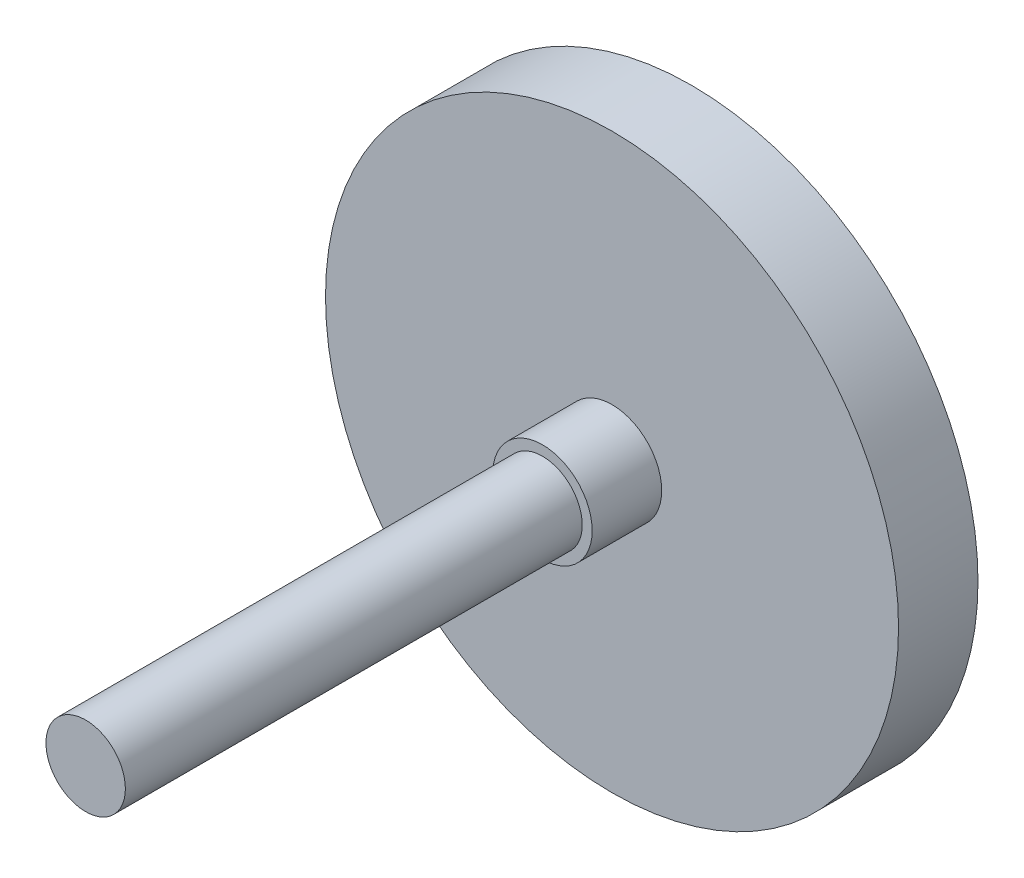
ISO-10303-21;
HEADER;
FILE_DESCRIPTION(('STEP AP214'),'2;1');
FILE_NAME('part.step','',(''),(''),'','','');
FILE_SCHEMA(('AUTOMOTIVE_DESIGN { 1 0 10303 214 1 1 1 1 }'));
ENDSEC;
DATA;
#1=APPLICATION_CONTEXT('core data for automotive mechanical design processes');
#2=APPLICATION_PROTOCOL_DEFINITION('international standard','automotive_design',2000,#1);
#3=PRODUCT_CONTEXT('',#1,'mechanical');
#4=PRODUCT('Part','Part','',(#3));
#5=PRODUCT_RELATED_PRODUCT_CATEGORY('part','',(#4));
#6=PRODUCT_DEFINITION_FORMATION('','',#4);
#7=PRODUCT_DEFINITION_CONTEXT('part definition',#1,'design');
#8=PRODUCT_DEFINITION('design','',#6,#7);
#9=PRODUCT_DEFINITION_SHAPE('','',#8);
#10=(LENGTH_UNIT() NAMED_UNIT(*) SI_UNIT(.MILLI.,.METRE.));
#11=(NAMED_UNIT(*) PLANE_ANGLE_UNIT() SI_UNIT($,.RADIAN.));
#12=(NAMED_UNIT(*) SI_UNIT($,.STERADIAN.) SOLID_ANGLE_UNIT());
#13=UNCERTAINTY_MEASURE_WITH_UNIT(LENGTH_MEASURE(1.E-05),#10,'distance_accuracy_value','');
#14=(GEOMETRIC_REPRESENTATION_CONTEXT(3) GLOBAL_UNCERTAINTY_ASSIGNED_CONTEXT((#13)) GLOBAL_UNIT_ASSIGNED_CONTEXT((#10,
#11,#12)) REPRESENTATION_CONTEXT('',''));
#15=CARTESIAN_POINT('',(0.,0.,0.));
#16=DIRECTION('',(0.,0.,1.));
#17=DIRECTION('',(1.,0.,0.));
#18=AXIS2_PLACEMENT_3D('',#15,#16,#17);
#19=CARTESIAN_POINT('',(0.,0.,8.));
#20=DIRECTION('',(0.,0.,-1.));
#21=DIRECTION('',(-1.,0.,0.));
#22=AXIS2_PLACEMENT_3D('',#19,#20,#21);
#23=CYLINDRICAL_SURFACE('',#22,28.85);
#24=CARTESIAN_POINT('',(0.,0.,8.));
#25=DIRECTION('',(0.,0.,1.));
#26=DIRECTION('',(1.,0.,0.));
#27=AXIS2_PLACEMENT_3D('',#24,#25,#26);
#28=CIRCLE('',#27,28.85);
#29=CARTESIAN_POINT('',(28.85,0.,8.));
#30=VERTEX_POINT('',#29);
#31=EDGE_CURVE('E42',#30,#30,#28,.T.);
#32=ORIENTED_EDGE('',*,*,#31,.F.);
#33=EDGE_LOOP('',(#32));
#34=FACE_BOUND('',#33,.T.);
#35=CARTESIAN_POINT('',(0.,0.,0.));
#36=DIRECTION('',(0.,0.,1.));
#37=DIRECTION('',(1.,0.,0.));
#38=AXIS2_PLACEMENT_3D('',#35,#36,#37);
#39=CIRCLE('',#38,28.85);
#40=CARTESIAN_POINT('',(28.85,0.,0.));
#41=VERTEX_POINT('',#40);
#42=EDGE_CURVE('E38',#41,#41,#39,.T.);
#43=ORIENTED_EDGE('',*,*,#42,.T.);
#44=EDGE_LOOP('',(#43));
#45=FACE_BOUND('',#44,.T.);
#46=ADVANCED_FACE('F35',(#34,#45),#23,.T.);
#47=CARTESIAN_POINT('',(0.,0.,8.));
#48=DIRECTION('',(0.,0.,1.));
#49=DIRECTION('',(1.,0.,0.));
#50=AXIS2_PLACEMENT_3D('',#47,#48,#49);
#51=PLANE('',#50);
#52=CARTESIAN_POINT('',(0.,0.,8.));
#53=DIRECTION('',(0.,0.,1.));
#54=DIRECTION('',(1.,0.,0.));
#55=AXIS2_PLACEMENT_3D('',#52,#53,#54);
#56=CIRCLE('',#55,5.);
#57=CARTESIAN_POINT('',(5.,0.,8.));
#58=VERTEX_POINT('',#57);
#59=EDGE_CURVE('E10',#58,#58,#56,.T.);
#60=ORIENTED_EDGE('',*,*,#59,.F.);
#61=EDGE_LOOP('',(#60));
#62=FACE_BOUND('',#61,.T.);
#63=ORIENTED_EDGE('',*,*,#31,.T.);
#64=EDGE_LOOP('',(#63));
#65=FACE_BOUND('',#64,.T.);
#66=ADVANCED_FACE('F86',(#62,#65),#51,.T.);
#67=CARTESIAN_POINT('',(0.,0.,0.));
#68=DIRECTION('',(0.,0.,1.));
#69=DIRECTION('',(1.,0.,0.));
#70=AXIS2_PLACEMENT_3D('',#67,#68,#69);
#71=PLANE('',#70);
#72=CARTESIAN_POINT('',(0.,0.,0.));
#73=DIRECTION('',(0.,0.,-1.));
#74=DIRECTION('',(-1.,0.,0.));
#75=AXIS2_PLACEMENT_3D('',#72,#73,#74);
#76=CIRCLE('',#75,4.);
#77=CARTESIAN_POINT('',(-4.,0.,0.));
#78=VERTEX_POINT('',#77);
#79=EDGE_CURVE('E54',#78,#78,#76,.T.);
#80=ORIENTED_EDGE('',*,*,#79,.F.);
#81=EDGE_LOOP('',(#80));
#82=FACE_BOUND('',#81,.T.);
#83=ORIENTED_EDGE('',*,*,#42,.F.);
#84=EDGE_LOOP('',(#83));
#85=FACE_BOUND('',#84,.T.);
#86=ADVANCED_FACE('F91',(#82,#85),#71,.F.);
#87=CARTESIAN_POINT('',(0.,0.,2.));
#88=DIRECTION('',(0.,0.,-1.));
#89=DIRECTION('',(-1.,0.,0.));
#90=AXIS2_PLACEMENT_3D('',#87,#88,#89);
#91=CYLINDRICAL_SURFACE('',#90,4.);
#92=CARTESIAN_POINT('',(0.,0.,2.));
#93=DIRECTION('',(0.,0.,-1.));
#94=DIRECTION('',(-1.,0.,0.));
#95=AXIS2_PLACEMENT_3D('',#92,#93,#94);
#96=CIRCLE('',#95,4.);
#97=CARTESIAN_POINT('',(-4.,0.,2.));
#98=VERTEX_POINT('',#97);
#99=EDGE_CURVE('E51',#98,#98,#96,.T.);
#100=ORIENTED_EDGE('',*,*,#99,.F.);
#101=EDGE_LOOP('',(#100));
#102=FACE_BOUND('',#101,.T.);
#103=ORIENTED_EDGE('',*,*,#79,.T.);
#104=EDGE_LOOP('',(#103));
#105=FACE_BOUND('',#104,.T.);
#106=ADVANCED_FACE('F100',(#102,#105),#91,.F.);
#107=CARTESIAN_POINT('',(0.,0.,2.));
#108=DIRECTION('',(0.,0.,-1.));
#109=DIRECTION('',(-1.,0.,0.));
#110=AXIS2_PLACEMENT_3D('',#107,#108,#109);
#111=PLANE('',#110);
#112=ORIENTED_EDGE('',*,*,#99,.T.);
#113=EDGE_LOOP('',(#112));
#114=FACE_BOUND('',#113,.T.);
#115=ADVANCED_FACE('F105',(#114),#111,.T.);
#116=CARTESIAN_POINT('',(0.,0.,15.));
#117=DIRECTION('',(0.,0.,1.));
#118=DIRECTION('',(1.,0.,0.));
#119=AXIS2_PLACEMENT_3D('',#116,#117,#118);
#120=PLANE('',#119);
#121=CARTESIAN_POINT('',(0.,0.,15.));
#122=DIRECTION('',(0.,0.,1.));
#123=DIRECTION('',(1.,0.,0.));
#124=AXIS2_PLACEMENT_3D('',#121,#122,#123);
#125=CIRCLE('',#124,5.);
#126=CARTESIAN_POINT('',(5.,0.,15.));
#127=VERTEX_POINT('',#126);
#128=EDGE_CURVE('E49',#127,#127,#125,.T.);
#129=ORIENTED_EDGE('',*,*,#128,.T.);
#130=EDGE_LOOP('',(#129));
#131=FACE_BOUND('',#130,.T.);
#132=CARTESIAN_POINT('',(0.,0.,15.));
#133=DIRECTION('',(0.,0.,1.));
#134=DIRECTION('',(1.,0.,0.));
#135=AXIS2_PLACEMENT_3D('',#132,#133,#134);
#136=CIRCLE('',#135,4.);
#137=CARTESIAN_POINT('',(4.,0.,15.));
#138=VERTEX_POINT('',#137);
#139=EDGE_CURVE('E59',#138,#138,#136,.T.);
#140=ORIENTED_EDGE('',*,*,#139,.F.);
#141=EDGE_LOOP('',(#140));
#142=FACE_BOUND('',#141,.T.);
#143=ADVANCED_FACE('F81',(#131,#142),#120,.T.);
#144=CARTESIAN_POINT('',(0.,0.,15.));
#145=DIRECTION('',(0.,0.,-1.));
#146=DIRECTION('',(-1.,0.,0.));
#147=AXIS2_PLACEMENT_3D('',#144,#145,#146);
#148=CYLINDRICAL_SURFACE('',#147,5.);
#149=ORIENTED_EDGE('',*,*,#128,.F.);
#150=EDGE_LOOP('',(#149));
#151=FACE_BOUND('',#150,.T.);
#152=ORIENTED_EDGE('',*,*,#59,.T.);
#153=EDGE_LOOP('',(#152));
#154=FACE_BOUND('',#153,.T.);
#155=ADVANCED_FACE('F74',(#151,#154),#148,.T.);
#156=CARTESIAN_POINT('',(0.,0.,61.));
#157=DIRECTION('',(0.,0.,-1.));
#158=DIRECTION('',(-1.,0.,0.));
#159=AXIS2_PLACEMENT_3D('',#156,#157,#158);
#160=CYLINDRICAL_SURFACE('',#159,4.);
#161=ORIENTED_EDGE('',*,*,#139,.T.);
#162=EDGE_LOOP('',(#161));
#163=FACE_BOUND('',#162,.T.);
#164=CARTESIAN_POINT('',(0.,0.,61.));
#165=DIRECTION('',(0.,0.,1.));
#166=DIRECTION('',(1.,0.,0.));
#167=AXIS2_PLACEMENT_3D('',#164,#165,#166);
#168=CIRCLE('',#167,4.);
#169=CARTESIAN_POINT('',(4.,0.,61.));
#170=VERTEX_POINT('',#169);
#171=EDGE_CURVE('E63',#170,#170,#168,.T.);
#172=ORIENTED_EDGE('',*,*,#171,.F.);
#173=EDGE_LOOP('',(#172));
#174=FACE_BOUND('',#173,.T.);
#175=ADVANCED_FACE('F72',(#163,#174),#160,.T.);
#176=CARTESIAN_POINT('',(0.,0.,61.));
#177=DIRECTION('',(0.,0.,1.));
#178=DIRECTION('',(1.,0.,0.));
#179=AXIS2_PLACEMENT_3D('',#176,#177,#178);
#180=PLANE('',#179);
#181=ORIENTED_EDGE('',*,*,#171,.T.);
#182=EDGE_LOOP('',(#181));
#183=FACE_BOUND('',#182,.T.);
#184=ADVANCED_FACE('F70',(#183),#180,.T.);
#185=CLOSED_SHELL('',(#46,#66,#86,#106,#115,#143,#155,#175,#184));
#186=MANIFOLD_SOLID_BREP('B2',#185);
#187=ADVANCED_BREP_SHAPE_REPRESENTATION('',(#18,#186),#14);
#188=SHAPE_DEFINITION_REPRESENTATION(#9,#187);
ENDSEC;
END-ISO-10303-21;
